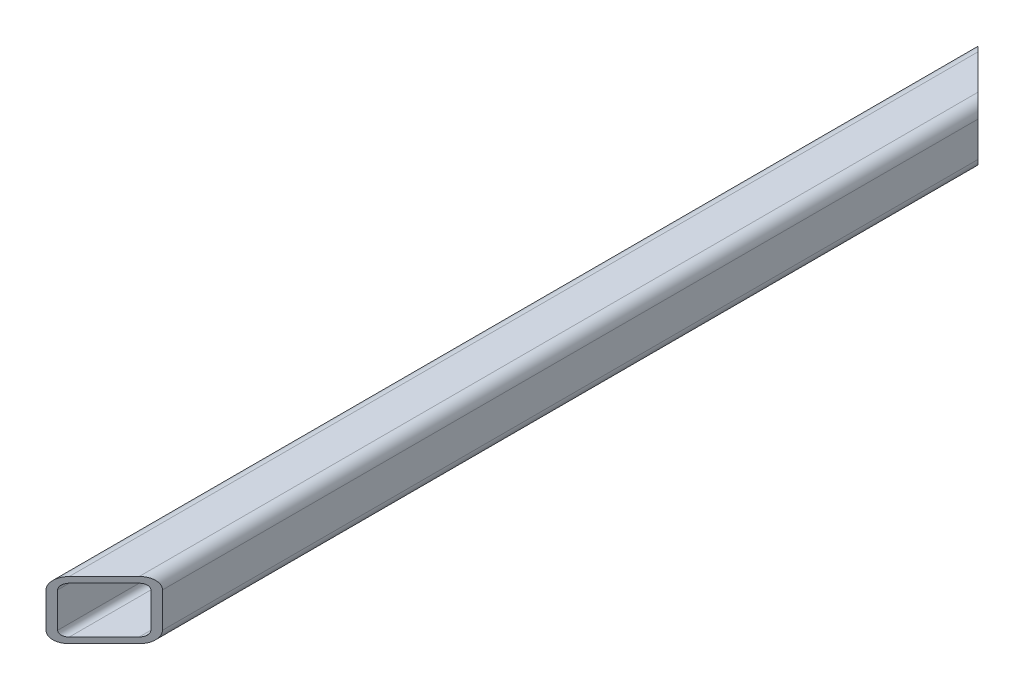
ISO-10303-21;
HEADER;
FILE_DESCRIPTION(('STEP AP214'),'2;1');
FILE_NAME('part.step','',(''),(''),'','','');
FILE_SCHEMA(('AUTOMOTIVE_DESIGN { 1 0 10303 214 1 1 1 1 }'));
ENDSEC;
DATA;
#1=APPLICATION_CONTEXT('core data for automotive mechanical design processes');
#2=APPLICATION_PROTOCOL_DEFINITION('international standard','automotive_design',2000,#1);
#3=PRODUCT_CONTEXT('',#1,'mechanical');
#4=PRODUCT('Part','Part','',(#3));
#5=PRODUCT_RELATED_PRODUCT_CATEGORY('part','',(#4));
#6=PRODUCT_DEFINITION_FORMATION('','',#4);
#7=PRODUCT_DEFINITION_CONTEXT('part definition',#1,'design');
#8=PRODUCT_DEFINITION('design','',#6,#7);
#9=PRODUCT_DEFINITION_SHAPE('','',#8);
#10=(LENGTH_UNIT() NAMED_UNIT(*) SI_UNIT(.MILLI.,.METRE.));
#11=(NAMED_UNIT(*) PLANE_ANGLE_UNIT() SI_UNIT($,.RADIAN.));
#12=(NAMED_UNIT(*) SI_UNIT($,.STERADIAN.) SOLID_ANGLE_UNIT());
#13=UNCERTAINTY_MEASURE_WITH_UNIT(LENGTH_MEASURE(1.E-05),#10,'distance_accuracy_value','');
#14=(GEOMETRIC_REPRESENTATION_CONTEXT(3) GLOBAL_UNCERTAINTY_ASSIGNED_CONTEXT((#13)) GLOBAL_UNIT_ASSIGNED_CONTEXT((#10,
#11,#12)) REPRESENTATION_CONTEXT('',''));
#15=CARTESIAN_POINT('',(0.,0.,0.));
#16=DIRECTION('',(0.,0.,1.));
#17=DIRECTION('',(1.,0.,0.));
#18=AXIS2_PLACEMENT_3D('',#15,#16,#17);
#19=CARTESIAN_POINT('',(-256.,226.,-2300.));
#20=DIRECTION('',(0.,0.,1.));
#21=DIRECTION('',(1.,0.,0.));
#22=AXIS2_PLACEMENT_3D('',#19,#20,#21);
#23=CYLINDRICAL_SURFACE('',#22,4.);
#24=CARTESIAN_POINT('',(-256.,226.,-1994.));
#25=DIRECTION('',(0.707106781186548,0.,0.707106781186547));
#26=DIRECTION('',(-0.707106781186547,0.,0.707106781186548));
#27=AXIS2_PLACEMENT_3D('',#24,#25,#26);
#28=ELLIPSE('',#27,5.65685424949239,4.);
#29=CARTESIAN_POINT('',(-256.,230.,-1994.));
#30=VERTEX_POINT('',#29);
#31=CARTESIAN_POINT('',(-260.,226.,-1990.));
#32=VERTEX_POINT('',#31);
#33=EDGE_CURVE('E185',#30,#32,#28,.T.);
#34=ORIENTED_EDGE('',*,*,#33,.F.);
#35=DIRECTION('',(0.,0.,1.));
#36=VECTOR('',#35,1.);
#37=CARTESIAN_POINT('',(-256.,230.,-2300.));
#38=LINE('',#37,#36);
#39=CARTESIAN_POINT('',(-256.,230.,-2306.));
#40=VERTEX_POINT('',#39);
#41=EDGE_CURVE('E265',#40,#30,#38,.T.);
#42=ORIENTED_EDGE('',*,*,#41,.F.);
#43=CARTESIAN_POINT('',(-256.,226.,-2306.));
#44=DIRECTION('',(0.707106781186547,0.,-0.707106781186548));
#45=DIRECTION('',(0.707106781186548,0.,0.707106781186547));
#46=AXIS2_PLACEMENT_3D('',#43,#44,#45);
#47=ELLIPSE('',#46,5.65685424949238,4.);
#48=CARTESIAN_POINT('',(-260.,226.,-2310.));
#49=VERTEX_POINT('',#48);
#50=EDGE_CURVE('E176',#49,#40,#47,.T.);
#51=ORIENTED_EDGE('',*,*,#50,.F.);
#52=DIRECTION('',(0.,0.,1.));
#53=VECTOR('',#52,1.);
#54=CARTESIAN_POINT('',(-260.,226.,-2300.));
#55=LINE('',#54,#53);
#56=EDGE_CURVE('E45',#49,#32,#55,.T.);
#57=ORIENTED_EDGE('',*,*,#56,.T.);
#58=EDGE_LOOP('',(#34,#42,#51,#57));
#59=FACE_BOUND('',#58,.T.);
#60=ADVANCED_FACE('F41',(#59),#23,.T.);
#61=CARTESIAN_POINT('',(-256.,230.,-2300.));
#62=DIRECTION('',(0.,-1.,0.));
#63=DIRECTION('',(0.,0.,-1.));
#64=AXIS2_PLACEMENT_3D('',#61,#62,#63);
#65=PLANE('',#64);
#66=DIRECTION('',(-0.707106781186547,0.,0.707106781186548));
#67=VECTOR('',#66,1.);
#68=CARTESIAN_POINT('',(-103.,230.,-2147.));
#69=LINE('',#68,#67);
#70=CARTESIAN_POINT('',(-244.,230.,-2006.));
#71=VERTEX_POINT('',#70);
#72=EDGE_CURVE('E182',#71,#30,#69,.T.);
#73=ORIENTED_EDGE('',*,*,#72,.F.);
#74=DIRECTION('',(0.,0.,1.));
#75=VECTOR('',#74,1.);
#76=CARTESIAN_POINT('',(-244.,230.,-2300.));
#77=LINE('',#76,#75);
#78=CARTESIAN_POINT('',(-244.,230.,-2294.));
#79=VERTEX_POINT('',#78);
#80=EDGE_CURVE('E263',#79,#71,#77,.T.);
#81=ORIENTED_EDGE('',*,*,#80,.F.);
#82=DIRECTION('',(0.707106781186548,0.,0.707106781186547));
#83=VECTOR('',#82,1.);
#84=CARTESIAN_POINT('',(-253.,230.,-2303.));
#85=LINE('',#84,#83);
#86=EDGE_CURVE('E281',#40,#79,#85,.T.);
#87=ORIENTED_EDGE('',*,*,#86,.F.);
#88=ORIENTED_EDGE('',*,*,#41,.T.);
#89=EDGE_LOOP('',(#73,#81,#87,#88));
#90=FACE_BOUND('',#89,.T.);
#91=ADVANCED_FACE('F272',(#90),#65,.F.);
#92=CARTESIAN_POINT('',(-244.,226.,-2300.));
#93=DIRECTION('',(0.,0.,1.));
#94=DIRECTION('',(1.,0.,0.));
#95=AXIS2_PLACEMENT_3D('',#92,#93,#94);
#96=CYLINDRICAL_SURFACE('',#95,4.);
#97=CARTESIAN_POINT('',(-244.,226.,-2006.));
#98=DIRECTION('',(0.707106781186548,0.,0.707106781186547));
#99=DIRECTION('',(-0.707106781186547,0.,0.707106781186548));
#100=AXIS2_PLACEMENT_3D('',#97,#98,#99);
#101=ELLIPSE('',#100,5.65685424949239,4.);
#102=CARTESIAN_POINT('',(-240.,226.,-2010.));
#103=VERTEX_POINT('',#102);
#104=EDGE_CURVE('E11',#103,#71,#101,.T.);
#105=ORIENTED_EDGE('',*,*,#104,.F.);
#106=DIRECTION('',(0.,0.,1.));
#107=VECTOR('',#106,1.);
#108=CARTESIAN_POINT('',(-240.,226.,-2300.));
#109=LINE('',#108,#107);
#110=CARTESIAN_POINT('',(-240.,226.,-2290.));
#111=VERTEX_POINT('',#110);
#112=EDGE_CURVE('E260',#111,#103,#109,.T.);
#113=ORIENTED_EDGE('',*,*,#112,.F.);
#114=CARTESIAN_POINT('',(-244.,226.,-2294.));
#115=DIRECTION('',(0.707106781186547,0.,-0.707106781186548));
#116=DIRECTION('',(0.707106781186548,0.,0.707106781186547));
#117=AXIS2_PLACEMENT_3D('',#114,#115,#116);
#118=ELLIPSE('',#117,5.65685424949238,4.);
#119=EDGE_CURVE('E278',#79,#111,#118,.T.);
#120=ORIENTED_EDGE('',*,*,#119,.F.);
#121=ORIENTED_EDGE('',*,*,#80,.T.);
#122=EDGE_LOOP('',(#105,#113,#120,#121));
#123=FACE_BOUND('',#122,.T.);
#124=ADVANCED_FACE('F275',(#123),#96,.T.);
#125=CARTESIAN_POINT('',(-240.,214.,-2300.));
#126=DIRECTION('',(-1.,0.,0.));
#127=DIRECTION('',(0.,0.,1.));
#128=AXIS2_PLACEMENT_3D('',#125,#126,#127);
#129=PLANE('',#128);
#130=DIRECTION('',(0.,1.,0.));
#131=VECTOR('',#130,1.);
#132=CARTESIAN_POINT('',(-240.,214.,-2010.));
#133=LINE('',#132,#131);
#134=CARTESIAN_POINT('',(-240.,214.,-2010.));
#135=VERTEX_POINT('',#134);
#136=EDGE_CURVE('E51',#135,#103,#133,.T.);
#137=ORIENTED_EDGE('',*,*,#136,.F.);
#138=DIRECTION('',(0.,0.,1.));
#139=VECTOR('',#138,1.);
#140=CARTESIAN_POINT('',(-240.,214.,-2300.));
#141=LINE('',#140,#139);
#142=CARTESIAN_POINT('',(-240.,214.,-2290.));
#143=VERTEX_POINT('',#142);
#144=EDGE_CURVE('E257',#143,#135,#141,.T.);
#145=ORIENTED_EDGE('',*,*,#144,.F.);
#146=DIRECTION('',(0.,-1.,0.));
#147=VECTOR('',#146,1.);
#148=CARTESIAN_POINT('',(-240.,214.,-2290.));
#149=LINE('',#148,#147);
#150=EDGE_CURVE('E280',#111,#143,#149,.T.);
#151=ORIENTED_EDGE('',*,*,#150,.F.);
#152=ORIENTED_EDGE('',*,*,#112,.T.);
#153=EDGE_LOOP('',(#137,#145,#151,#152));
#154=FACE_BOUND('',#153,.T.);
#155=ADVANCED_FACE('F291',(#154),#129,.F.);
#156=CARTESIAN_POINT('',(-244.,214.,-2300.));
#157=DIRECTION('',(0.,0.,1.));
#158=DIRECTION('',(1.,0.,0.));
#159=AXIS2_PLACEMENT_3D('',#156,#157,#158);
#160=CYLINDRICAL_SURFACE('',#159,4.);
#161=CARTESIAN_POINT('',(-244.,214.,-2006.));
#162=DIRECTION('',(0.707106781186548,0.,0.707106781186547));
#163=DIRECTION('',(-0.707106781186547,0.,0.707106781186548));
#164=AXIS2_PLACEMENT_3D('',#161,#162,#163);
#165=ELLIPSE('',#164,5.65685424949239,4.);
#166=CARTESIAN_POINT('',(-244.,210.,-2006.));
#167=VERTEX_POINT('',#166);
#168=EDGE_CURVE('E200',#167,#135,#165,.T.);
#169=ORIENTED_EDGE('',*,*,#168,.F.);
#170=DIRECTION('',(0.,0.,1.));
#171=VECTOR('',#170,1.);
#172=CARTESIAN_POINT('',(-244.,210.,-2300.));
#173=LINE('',#172,#171);
#174=CARTESIAN_POINT('',(-244.,210.,-2294.));
#175=VERTEX_POINT('',#174);
#176=EDGE_CURVE('E254',#175,#167,#173,.T.);
#177=ORIENTED_EDGE('',*,*,#176,.F.);
#178=CARTESIAN_POINT('',(-244.,214.,-2294.));
#179=DIRECTION('',(0.707106781186547,0.,-0.707106781186548));
#180=DIRECTION('',(0.707106781186548,0.,0.707106781186547));
#181=AXIS2_PLACEMENT_3D('',#178,#179,#180);
#182=ELLIPSE('',#181,5.65685424949238,4.);
#183=EDGE_CURVE('E187',#143,#175,#182,.T.);
#184=ORIENTED_EDGE('',*,*,#183,.F.);
#185=ORIENTED_EDGE('',*,*,#144,.T.);
#186=EDGE_LOOP('',(#169,#177,#184,#185));
#187=FACE_BOUND('',#186,.T.);
#188=ADVANCED_FACE('F289',(#187),#160,.T.);
#189=CARTESIAN_POINT('',(-244.,210.,-2300.));
#190=DIRECTION('',(0.,1.,0.));
#191=DIRECTION('',(0.,0.,1.));
#192=AXIS2_PLACEMENT_3D('',#189,#190,#191);
#193=PLANE('',#192);
#194=DIRECTION('',(0.707106781186547,0.,-0.707106781186548));
#195=VECTOR('',#194,1.);
#196=CARTESIAN_POINT('',(-97.,210.,-2153.));
#197=LINE('',#196,#195);
#198=CARTESIAN_POINT('',(-256.,210.,-1994.));
#199=VERTEX_POINT('',#198);
#200=EDGE_CURVE('E203',#199,#167,#197,.T.);
#201=ORIENTED_EDGE('',*,*,#200,.F.);
#202=DIRECTION('',(0.,0.,1.));
#203=VECTOR('',#202,1.);
#204=CARTESIAN_POINT('',(-256.,210.,-2300.));
#205=LINE('',#204,#203);
#206=CARTESIAN_POINT('',(-256.,210.,-2306.));
#207=VERTEX_POINT('',#206);
#208=EDGE_CURVE('E252',#207,#199,#205,.T.);
#209=ORIENTED_EDGE('',*,*,#208,.F.);
#210=DIRECTION('',(-0.707106781186548,0.,-0.707106781186547));
#211=VECTOR('',#210,1.);
#212=CARTESIAN_POINT('',(-247.,210.,-2297.));
#213=LINE('',#212,#211);
#214=EDGE_CURVE('E181',#175,#207,#213,.T.);
#215=ORIENTED_EDGE('',*,*,#214,.F.);
#216=ORIENTED_EDGE('',*,*,#176,.T.);
#217=EDGE_LOOP('',(#201,#209,#215,#216));
#218=FACE_BOUND('',#217,.T.);
#219=ADVANCED_FACE('F293',(#218),#193,.F.);
#220=CARTESIAN_POINT('',(-256.,214.,-2300.));
#221=DIRECTION('',(0.,0.,1.));
#222=DIRECTION('',(1.,0.,0.));
#223=AXIS2_PLACEMENT_3D('',#220,#221,#222);
#224=CYLINDRICAL_SURFACE('',#223,4.);
#225=CARTESIAN_POINT('',(-256.,214.,-1994.));
#226=DIRECTION('',(0.707106781186548,0.,0.707106781186547));
#227=DIRECTION('',(-0.707106781186547,0.,0.707106781186548));
#228=AXIS2_PLACEMENT_3D('',#225,#226,#227);
#229=ELLIPSE('',#228,5.65685424949239,4.);
#230=CARTESIAN_POINT('',(-260.,214.,-1990.));
#231=VERTEX_POINT('',#230);
#232=EDGE_CURVE('E164',#231,#199,#229,.T.);
#233=ORIENTED_EDGE('',*,*,#232,.F.);
#234=DIRECTION('',(0.,0.,1.));
#235=VECTOR('',#234,1.);
#236=CARTESIAN_POINT('',(-260.,214.,-2300.));
#237=LINE('',#236,#235);
#238=CARTESIAN_POINT('',(-260.,214.,-2310.));
#239=VERTEX_POINT('',#238);
#240=EDGE_CURVE('E156',#239,#231,#237,.T.);
#241=ORIENTED_EDGE('',*,*,#240,.F.);
#242=CARTESIAN_POINT('',(-256.,214.,-2306.));
#243=DIRECTION('',(0.707106781186547,0.,-0.707106781186548));
#244=DIRECTION('',(0.707106781186548,0.,0.707106781186547));
#245=AXIS2_PLACEMENT_3D('',#242,#243,#244);
#246=ELLIPSE('',#245,5.65685424949238,4.);
#247=EDGE_CURVE('E161',#207,#239,#246,.T.);
#248=ORIENTED_EDGE('',*,*,#247,.F.);
#249=ORIENTED_EDGE('',*,*,#208,.T.);
#250=EDGE_LOOP('',(#233,#241,#248,#249));
#251=FACE_BOUND('',#250,.T.);
#252=ADVANCED_FACE('F158',(#251),#224,.T.);
#253=CARTESIAN_POINT('',(-244.,226.,-2300.));
#254=DIRECTION('',(0.,0.,1.));
#255=DIRECTION('',(1.,0.,0.));
#256=AXIS2_PLACEMENT_3D('',#253,#254,#255);
#257=CYLINDRICAL_SURFACE('',#256,2.);
#258=DIRECTION('',(0.,0.,1.));
#259=VECTOR('',#258,1.);
#260=CARTESIAN_POINT('',(-242.,226.,-2300.));
#261=LINE('',#260,#259);
#262=CARTESIAN_POINT('',(-242.,226.,-2292.));
#263=VERTEX_POINT('',#262);
#264=CARTESIAN_POINT('',(-242.,226.,-2008.));
#265=VERTEX_POINT('',#264);
#266=EDGE_CURVE('E209',#263,#265,#261,.T.);
#267=ORIENTED_EDGE('',*,*,#266,.T.);
#268=CARTESIAN_POINT('',(-244.,226.,-2006.));
#269=DIRECTION('',(0.707106781186548,0.,0.707106781186547));
#270=DIRECTION('',(-0.707106781186547,0.,0.707106781186548));
#271=AXIS2_PLACEMENT_3D('',#268,#269,#270);
#272=ELLIPSE('',#271,2.82842712474619,2.);
#273=CARTESIAN_POINT('',(-244.,228.,-2006.));
#274=VERTEX_POINT('',#273);
#275=EDGE_CURVE('E87',#265,#274,#272,.T.);
#276=ORIENTED_EDGE('',*,*,#275,.T.);
#277=DIRECTION('',(0.,0.,1.));
#278=VECTOR('',#277,1.);
#279=CARTESIAN_POINT('',(-244.,228.,-2300.));
#280=LINE('',#279,#278);
#281=CARTESIAN_POINT('',(-244.,228.,-2294.));
#282=VERTEX_POINT('',#281);
#283=EDGE_CURVE('E212',#282,#274,#280,.T.);
#284=ORIENTED_EDGE('',*,*,#283,.F.);
#285=CARTESIAN_POINT('',(-244.,226.,-2294.));
#286=DIRECTION('',(0.707106781186547,0.,-0.707106781186548));
#287=DIRECTION('',(0.707106781186548,0.,0.707106781186547));
#288=AXIS2_PLACEMENT_3D('',#285,#286,#287);
#289=ELLIPSE('',#288,2.82842712474619,2.);
#290=EDGE_CURVE('E208',#282,#263,#289,.T.);
#291=ORIENTED_EDGE('',*,*,#290,.T.);
#292=EDGE_LOOP('',(#267,#276,#284,#291));
#293=FACE_BOUND('',#292,.T.);
#294=ADVANCED_FACE('F300',(#293),#257,.F.);
#295=CARTESIAN_POINT('',(-256.,228.,-2300.));
#296=DIRECTION('',(0.,-1.,0.));
#297=DIRECTION('',(0.,0.,-1.));
#298=AXIS2_PLACEMENT_3D('',#295,#296,#297);
#299=PLANE('',#298);
#300=ORIENTED_EDGE('',*,*,#283,.T.);
#301=DIRECTION('',(-0.707106781186547,0.,0.707106781186548));
#302=VECTOR('',#301,1.);
#303=CARTESIAN_POINT('',(-103.,228.,-2147.));
#304=LINE('',#303,#302);
#305=CARTESIAN_POINT('',(-256.,228.,-1994.));
#306=VERTEX_POINT('',#305);
#307=EDGE_CURVE('E60',#274,#306,#304,.T.);
#308=ORIENTED_EDGE('',*,*,#307,.T.);
#309=DIRECTION('',(0.,0.,1.));
#310=VECTOR('',#309,1.);
#311=CARTESIAN_POINT('',(-256.,228.,-2300.));
#312=LINE('',#311,#310);
#313=CARTESIAN_POINT('',(-256.,228.,-2306.));
#314=VERTEX_POINT('',#313);
#315=EDGE_CURVE('E217',#314,#306,#312,.T.);
#316=ORIENTED_EDGE('',*,*,#315,.F.);
#317=DIRECTION('',(0.707106781186548,0.,0.707106781186547));
#318=VECTOR('',#317,1.);
#319=CARTESIAN_POINT('',(-253.,228.,-2303.));
#320=LINE('',#319,#318);
#321=EDGE_CURVE('E211',#314,#282,#320,.T.);
#322=ORIENTED_EDGE('',*,*,#321,.T.);
#323=EDGE_LOOP('',(#300,#308,#316,#322));
#324=FACE_BOUND('',#323,.T.);
#325=ADVANCED_FACE('F342',(#324),#299,.T.);
#326=CARTESIAN_POINT('',(-256.,226.,-2300.));
#327=DIRECTION('',(0.,0.,1.));
#328=DIRECTION('',(1.,0.,0.));
#329=AXIS2_PLACEMENT_3D('',#326,#327,#328);
#330=CYLINDRICAL_SURFACE('',#329,2.);
#331=ORIENTED_EDGE('',*,*,#315,.T.);
#332=CARTESIAN_POINT('',(-256.,226.,-1994.));
#333=DIRECTION('',(0.707106781186548,0.,0.707106781186547));
#334=DIRECTION('',(-0.707106781186547,0.,0.707106781186548));
#335=AXIS2_PLACEMENT_3D('',#332,#333,#334);
#336=ELLIPSE('',#335,2.82842712474619,2.);
#337=CARTESIAN_POINT('',(-258.,226.,-1992.));
#338=VERTEX_POINT('',#337);
#339=EDGE_CURVE('E213',#306,#338,#336,.T.);
#340=ORIENTED_EDGE('',*,*,#339,.T.);
#341=DIRECTION('',(0.,0.,1.));
#342=VECTOR('',#341,1.);
#343=CARTESIAN_POINT('',(-258.,226.,-2300.));
#344=LINE('',#343,#342);
#345=CARTESIAN_POINT('',(-258.,226.,-2308.));
#346=VERTEX_POINT('',#345);
#347=EDGE_CURVE('E222',#346,#338,#344,.T.);
#348=ORIENTED_EDGE('',*,*,#347,.F.);
#349=CARTESIAN_POINT('',(-256.,226.,-2306.));
#350=DIRECTION('',(0.707106781186547,0.,-0.707106781186548));
#351=DIRECTION('',(0.707106781186548,0.,0.707106781186547));
#352=AXIS2_PLACEMENT_3D('',#349,#350,#351);
#353=ELLIPSE('',#352,2.82842712474619,2.);
#354=EDGE_CURVE('E216',#346,#314,#353,.T.);
#355=ORIENTED_EDGE('',*,*,#354,.T.);
#356=EDGE_LOOP('',(#331,#340,#348,#355));
#357=FACE_BOUND('',#356,.T.);
#358=ADVANCED_FACE('F352',(#357),#330,.F.);
#359=CARTESIAN_POINT('',(-258.,226.,-2300.));
#360=DIRECTION('',(1.,0.,0.));
#361=DIRECTION('',(0.,0.,-1.));
#362=AXIS2_PLACEMENT_3D('',#359,#360,#361);
#363=PLANE('',#362);
#364=ORIENTED_EDGE('',*,*,#347,.T.);
#365=DIRECTION('',(0.,-1.,0.));
#366=VECTOR('',#365,1.);
#367=CARTESIAN_POINT('',(-258.,226.,-1992.));
#368=LINE('',#367,#366);
#369=CARTESIAN_POINT('',(-258.,214.,-1992.));
#370=VERTEX_POINT('',#369);
#371=EDGE_CURVE('E218',#338,#370,#368,.T.);
#372=ORIENTED_EDGE('',*,*,#371,.T.);
#373=DIRECTION('',(0.,0.,1.));
#374=VECTOR('',#373,1.);
#375=CARTESIAN_POINT('',(-258.,214.,-2300.));
#376=LINE('',#375,#374);
#377=CARTESIAN_POINT('',(-258.,214.,-2308.));
#378=VERTEX_POINT('',#377);
#379=EDGE_CURVE('E227',#378,#370,#376,.T.);
#380=ORIENTED_EDGE('',*,*,#379,.F.);
#381=DIRECTION('',(0.,1.,0.));
#382=VECTOR('',#381,1.);
#383=CARTESIAN_POINT('',(-258.,226.,-2308.));
#384=LINE('',#383,#382);
#385=EDGE_CURVE('E221',#378,#346,#384,.T.);
#386=ORIENTED_EDGE('',*,*,#385,.T.);
#387=EDGE_LOOP('',(#364,#372,#380,#386));
#388=FACE_BOUND('',#387,.T.);
#389=ADVANCED_FACE('F362',(#388),#363,.T.);
#390=CARTESIAN_POINT('',(-256.,214.,-2300.));
#391=DIRECTION('',(0.,0.,1.));
#392=DIRECTION('',(1.,0.,0.));
#393=AXIS2_PLACEMENT_3D('',#390,#391,#392);
#394=CYLINDRICAL_SURFACE('',#393,2.);
#395=ORIENTED_EDGE('',*,*,#379,.T.);
#396=CARTESIAN_POINT('',(-256.,214.,-1994.));
#397=DIRECTION('',(0.707106781186548,0.,0.707106781186547));
#398=DIRECTION('',(-0.707106781186547,0.,0.707106781186548));
#399=AXIS2_PLACEMENT_3D('',#396,#397,#398);
#400=ELLIPSE('',#399,2.82842712474619,2.);
#401=CARTESIAN_POINT('',(-256.,212.,-1994.));
#402=VERTEX_POINT('',#401);
#403=EDGE_CURVE('E223',#370,#402,#400,.T.);
#404=ORIENTED_EDGE('',*,*,#403,.T.);
#405=DIRECTION('',(0.,0.,1.));
#406=VECTOR('',#405,1.);
#407=CARTESIAN_POINT('',(-256.,212.,-2300.));
#408=LINE('',#407,#406);
#409=CARTESIAN_POINT('',(-256.,212.,-2306.));
#410=VERTEX_POINT('',#409);
#411=EDGE_CURVE('E232',#410,#402,#408,.T.);
#412=ORIENTED_EDGE('',*,*,#411,.F.);
#413=CARTESIAN_POINT('',(-256.,214.,-2306.));
#414=DIRECTION('',(0.707106781186547,0.,-0.707106781186548));
#415=DIRECTION('',(0.707106781186548,0.,0.707106781186547));
#416=AXIS2_PLACEMENT_3D('',#413,#414,#415);
#417=ELLIPSE('',#416,2.82842712474619,2.);
#418=EDGE_CURVE('E226',#410,#378,#417,.T.);
#419=ORIENTED_EDGE('',*,*,#418,.T.);
#420=EDGE_LOOP('',(#395,#404,#412,#419));
#421=FACE_BOUND('',#420,.T.);
#422=ADVANCED_FACE('F372',(#421),#394,.F.);
#423=CARTESIAN_POINT('',(-244.,212.,-2300.));
#424=DIRECTION('',(0.,1.,0.));
#425=DIRECTION('',(0.,0.,1.));
#426=AXIS2_PLACEMENT_3D('',#423,#424,#425);
#427=PLANE('',#426);
#428=ORIENTED_EDGE('',*,*,#411,.T.);
#429=DIRECTION('',(0.707106781186547,0.,-0.707106781186548));
#430=VECTOR('',#429,1.);
#431=CARTESIAN_POINT('',(-96.9999999999999,212.,-2153.));
#432=LINE('',#431,#430);
#433=CARTESIAN_POINT('',(-244.,212.,-2006.));
#434=VERTEX_POINT('',#433);
#435=EDGE_CURVE('E228',#402,#434,#432,.T.);
#436=ORIENTED_EDGE('',*,*,#435,.T.);
#437=DIRECTION('',(0.,0.,1.));
#438=VECTOR('',#437,1.);
#439=CARTESIAN_POINT('',(-244.,212.,-2300.));
#440=LINE('',#439,#438);
#441=CARTESIAN_POINT('',(-244.,212.,-2294.));
#442=VERTEX_POINT('',#441);
#443=EDGE_CURVE('E236',#442,#434,#440,.T.);
#444=ORIENTED_EDGE('',*,*,#443,.F.);
#445=DIRECTION('',(-0.707106781186548,0.,-0.707106781186547));
#446=VECTOR('',#445,1.);
#447=CARTESIAN_POINT('',(-247.,212.,-2297.));
#448=LINE('',#447,#446);
#449=EDGE_CURVE('E231',#442,#410,#448,.T.);
#450=ORIENTED_EDGE('',*,*,#449,.T.);
#451=EDGE_LOOP('',(#428,#436,#444,#450));
#452=FACE_BOUND('',#451,.T.);
#453=ADVANCED_FACE('F382',(#452),#427,.T.);
#454=CARTESIAN_POINT('',(-244.,214.,-2300.));
#455=DIRECTION('',(0.,0.,1.));
#456=DIRECTION('',(1.,0.,0.));
#457=AXIS2_PLACEMENT_3D('',#454,#455,#456);
#458=CYLINDRICAL_SURFACE('',#457,2.);
#459=ORIENTED_EDGE('',*,*,#443,.T.);
#460=CARTESIAN_POINT('',(-244.,214.,-2006.));
#461=DIRECTION('',(0.707106781186548,0.,0.707106781186547));
#462=DIRECTION('',(-0.707106781186547,0.,0.707106781186548));
#463=AXIS2_PLACEMENT_3D('',#460,#461,#462);
#464=ELLIPSE('',#463,2.82842712474619,2.);
#465=CARTESIAN_POINT('',(-242.,214.,-2008.));
#466=VERTEX_POINT('',#465);
#467=EDGE_CURVE('E233',#434,#466,#464,.T.);
#468=ORIENTED_EDGE('',*,*,#467,.T.);
#469=DIRECTION('',(0.,0.,1.));
#470=VECTOR('',#469,1.);
#471=CARTESIAN_POINT('',(-242.,214.,-2300.));
#472=LINE('',#471,#470);
#473=CARTESIAN_POINT('',(-242.,214.,-2292.));
#474=VERTEX_POINT('',#473);
#475=EDGE_CURVE('E194',#474,#466,#472,.T.);
#476=ORIENTED_EDGE('',*,*,#475,.F.);
#477=CARTESIAN_POINT('',(-244.,214.,-2294.));
#478=DIRECTION('',(0.707106781186547,0.,-0.707106781186548));
#479=DIRECTION('',(0.707106781186548,0.,0.707106781186547));
#480=AXIS2_PLACEMENT_3D('',#477,#478,#479);
#481=ELLIPSE('',#480,2.82842712474619,2.);
#482=EDGE_CURVE('E235',#474,#442,#481,.T.);
#483=ORIENTED_EDGE('',*,*,#482,.T.);
#484=EDGE_LOOP('',(#459,#468,#476,#483));
#485=FACE_BOUND('',#484,.T.);
#486=ADVANCED_FACE('F392',(#485),#458,.F.);
#487=CARTESIAN_POINT('',(-242.,214.,-2300.));
#488=DIRECTION('',(-1.,0.,0.));
#489=DIRECTION('',(0.,0.,1.));
#490=AXIS2_PLACEMENT_3D('',#487,#488,#489);
#491=PLANE('',#490);
#492=ORIENTED_EDGE('',*,*,#475,.T.);
#493=DIRECTION('',(0.,1.,0.));
#494=VECTOR('',#493,1.);
#495=CARTESIAN_POINT('',(-242.,214.,-2008.));
#496=LINE('',#495,#494);
#497=EDGE_CURVE('E82',#466,#265,#496,.T.);
#498=ORIENTED_EDGE('',*,*,#497,.T.);
#499=ORIENTED_EDGE('',*,*,#266,.F.);
#500=DIRECTION('',(0.,-1.,0.));
#501=VECTOR('',#500,1.);
#502=CARTESIAN_POINT('',(-242.,214.,-2292.));
#503=LINE('',#502,#501);
#504=EDGE_CURVE('E169',#263,#474,#503,.T.);
#505=ORIENTED_EDGE('',*,*,#504,.T.);
#506=EDGE_LOOP('',(#492,#498,#499,#505));
#507=FACE_BOUND('',#506,.T.);
#508=ADVANCED_FACE('F402',(#507),#491,.T.);
#509=CARTESIAN_POINT('',(-260.,226.,-2300.));
#510=DIRECTION('',(1.,0.,0.));
#511=DIRECTION('',(0.,0.,-1.));
#512=AXIS2_PLACEMENT_3D('',#509,#510,#511);
#513=PLANE('',#512);
#514=DIRECTION('',(0.,-1.,0.));
#515=VECTOR('',#514,1.);
#516=CARTESIAN_POINT('',(-260.,226.,-1990.));
#517=LINE('',#516,#515);
#518=EDGE_CURVE('E196',#32,#231,#517,.T.);
#519=ORIENTED_EDGE('',*,*,#518,.F.);
#520=ORIENTED_EDGE('',*,*,#56,.F.);
#521=DIRECTION('',(0.,1.,0.));
#522=VECTOR('',#521,1.);
#523=CARTESIAN_POINT('',(-260.,226.,-2310.));
#524=LINE('',#523,#522);
#525=EDGE_CURVE('E168',#239,#49,#524,.T.);
#526=ORIENTED_EDGE('',*,*,#525,.F.);
#527=ORIENTED_EDGE('',*,*,#240,.T.);
#528=EDGE_LOOP('',(#519,#520,#526,#527));
#529=FACE_BOUND('',#528,.T.);
#530=ADVANCED_FACE('F172',(#529),#513,.F.);
#531=CARTESIAN_POINT('',(-250.,220.,-2300.));
#532=DIRECTION('',(0.707106781186547,0.,-0.707106781186548));
#533=DIRECTION('',(-0.707106781186548,0.,-0.707106781186547));
#534=AXIS2_PLACEMENT_3D('',#531,#532,#533);
#535=PLANE('',#534);
#536=ORIENTED_EDGE('',*,*,#290,.F.);
#537=ORIENTED_EDGE('',*,*,#321,.F.);
#538=ORIENTED_EDGE('',*,*,#354,.F.);
#539=ORIENTED_EDGE('',*,*,#385,.F.);
#540=ORIENTED_EDGE('',*,*,#418,.F.);
#541=ORIENTED_EDGE('',*,*,#449,.F.);
#542=ORIENTED_EDGE('',*,*,#482,.F.);
#543=ORIENTED_EDGE('',*,*,#504,.F.);
#544=EDGE_LOOP('',(#536,#537,#538,#539,#540,#541,#542,#543));
#545=FACE_BOUND('',#544,.T.);
#546=ORIENTED_EDGE('',*,*,#525,.T.);
#547=ORIENTED_EDGE('',*,*,#50,.T.);
#548=ORIENTED_EDGE('',*,*,#86,.T.);
#549=ORIENTED_EDGE('',*,*,#119,.T.);
#550=ORIENTED_EDGE('',*,*,#150,.T.);
#551=ORIENTED_EDGE('',*,*,#183,.T.);
#552=ORIENTED_EDGE('',*,*,#214,.T.);
#553=ORIENTED_EDGE('',*,*,#247,.T.);
#554=EDGE_LOOP('',(#546,#547,#548,#549,#550,#551,#552,#553));
#555=FACE_BOUND('',#554,.T.);
#556=ADVANCED_FACE('F179',(#545,#555),#535,.T.);
#557=CARTESIAN_POINT('',(-250.,220.,-2000.));
#558=DIRECTION('',(0.707106781186548,0.,0.707106781186547));
#559=DIRECTION('',(0.707106781186547,0.,-0.707106781186548));
#560=AXIS2_PLACEMENT_3D('',#557,#558,#559);
#561=PLANE('',#560);
#562=ORIENTED_EDGE('',*,*,#275,.F.);
#563=ORIENTED_EDGE('',*,*,#497,.F.);
#564=ORIENTED_EDGE('',*,*,#467,.F.);
#565=ORIENTED_EDGE('',*,*,#435,.F.);
#566=ORIENTED_EDGE('',*,*,#403,.F.);
#567=ORIENTED_EDGE('',*,*,#371,.F.);
#568=ORIENTED_EDGE('',*,*,#339,.F.);
#569=ORIENTED_EDGE('',*,*,#307,.F.);
#570=EDGE_LOOP('',(#562,#563,#564,#565,#566,#567,#568,#569));
#571=FACE_BOUND('',#570,.T.);
#572=ORIENTED_EDGE('',*,*,#72,.T.);
#573=ORIENTED_EDGE('',*,*,#33,.T.);
#574=ORIENTED_EDGE('',*,*,#518,.T.);
#575=ORIENTED_EDGE('',*,*,#232,.T.);
#576=ORIENTED_EDGE('',*,*,#200,.T.);
#577=ORIENTED_EDGE('',*,*,#168,.T.);
#578=ORIENTED_EDGE('',*,*,#136,.T.);
#579=ORIENTED_EDGE('',*,*,#104,.T.);
#580=EDGE_LOOP('',(#572,#573,#574,#575,#576,#577,#578,#579));
#581=FACE_BOUND('',#580,.T.);
#582=ADVANCED_FACE('F43',(#571,#581),#561,.T.);
#583=CLOSED_SHELL('',(#60,#91,#124,#155,#188,#219,#252,#294,#325,#358,#389,#422,#453,#486,#508,
#530,#556,#582));
#584=MANIFOLD_SOLID_BREP('B2',#583);
#585=ADVANCED_BREP_SHAPE_REPRESENTATION('',(#18,#584),#14);
#586=SHAPE_DEFINITION_REPRESENTATION(#9,#585);
ENDSEC;
END-ISO-10303-21;
